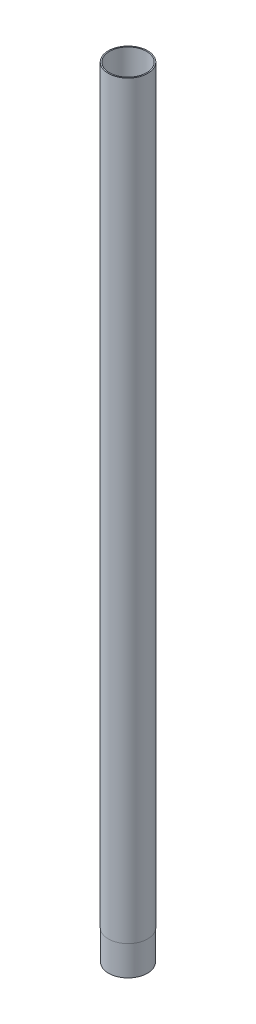
ISO-10303-21;
HEADER;
FILE_DESCRIPTION(('STEP AP214'),'2;1');
FILE_NAME('part.step','',(''),(''),'','','');
FILE_SCHEMA(('AUTOMOTIVE_DESIGN { 1 0 10303 214 1 1 1 1 }'));
ENDSEC;
DATA;
#1=APPLICATION_CONTEXT('core data for automotive mechanical design processes');
#2=APPLICATION_PROTOCOL_DEFINITION('international standard','automotive_design',2000,#1);
#3=PRODUCT_CONTEXT('',#1,'mechanical');
#4=PRODUCT('Part','Part','',(#3));
#5=PRODUCT_RELATED_PRODUCT_CATEGORY('part','',(#4));
#6=PRODUCT_DEFINITION_FORMATION('','',#4);
#7=PRODUCT_DEFINITION_CONTEXT('part definition',#1,'design');
#8=PRODUCT_DEFINITION('design','',#6,#7);
#9=PRODUCT_DEFINITION_SHAPE('','',#8);
#10=(LENGTH_UNIT() NAMED_UNIT(*) SI_UNIT(.MILLI.,.METRE.));
#11=(NAMED_UNIT(*) PLANE_ANGLE_UNIT() SI_UNIT($,.RADIAN.));
#12=(NAMED_UNIT(*) SI_UNIT($,.STERADIAN.) SOLID_ANGLE_UNIT());
#13=UNCERTAINTY_MEASURE_WITH_UNIT(LENGTH_MEASURE(1.E-05),#10,'distance_accuracy_value','');
#14=(GEOMETRIC_REPRESENTATION_CONTEXT(3) GLOBAL_UNCERTAINTY_ASSIGNED_CONTEXT((#13)) GLOBAL_UNIT_ASSIGNED_CONTEXT((#10,
#11,#12)) REPRESENTATION_CONTEXT('',''));
#15=CARTESIAN_POINT('',(0.,0.,0.));
#16=DIRECTION('',(0.,0.,1.));
#17=DIRECTION('',(1.,0.,0.));
#18=AXIS2_PLACEMENT_3D('',#15,#16,#17);
#19=CARTESIAN_POINT('',(9.525,0.,0.));
#20=DIRECTION('',(0.,-1.,0.));
#21=DIRECTION('',(0.,0.,-1.));
#22=AXIS2_PLACEMENT_3D('',#19,#20,#21);
#23=PLANE('',#22);
#24=CARTESIAN_POINT('',(9.525,0.,0.));
#25=DIRECTION('',(0.,1.,0.));
#26=DIRECTION('',(-1.,0.,0.));
#27=AXIS2_PLACEMENT_3D('',#24,#25,#26);
#28=CIRCLE('',#27,8.975);
#29=CARTESIAN_POINT('',(18.5,0.,0.));
#30=VERTEX_POINT('',#29);
#31=EDGE_CURVE('E27',#30,#30,#28,.T.);
#32=ORIENTED_EDGE('',*,*,#31,.F.);
#33=EDGE_LOOP('',(#32));
#34=FACE_BOUND('',#33,.T.);
#35=CARTESIAN_POINT('',(9.525,0.,0.));
#36=DIRECTION('',(0.,-1.,0.));
#37=DIRECTION('',(-1.,0.,0.));
#38=AXIS2_PLACEMENT_3D('',#35,#36,#37);
#39=CIRCLE('',#38,9.525);
#40=CARTESIAN_POINT('',(19.05,0.,0.));
#41=VERTEX_POINT('',#40);
#42=EDGE_CURVE('E59',#41,#41,#39,.T.);
#43=ORIENTED_EDGE('',*,*,#42,.F.);
#44=EDGE_LOOP('',(#43));
#45=FACE_BOUND('',#44,.T.);
#46=ADVANCED_FACE('F17',(#34,#45),#23,.F.);
#47=CARTESIAN_POINT('',(9.525,18.87,0.));
#48=DIRECTION('',(0.,-1.,0.));
#49=DIRECTION('',(-1.,0.,0.));
#50=AXIS2_PLACEMENT_3D('',#47,#48,#49);
#51=CYLINDRICAL_SURFACE('',#50,8.975);
#52=ORIENTED_EDGE('',*,*,#31,.T.);
#53=DIRECTION('',(0.,-1.,0.));
#54=VECTOR('',#53,1.);
#55=CARTESIAN_POINT('',(18.5,18.87,0.));
#56=LINE('',#55,#54);
#57=CARTESIAN_POINT('',(18.5,-377.4,0.));
#58=VERTEX_POINT('',#57);
#59=EDGE_CURVE('E11',#30,#58,#56,.T.);
#60=ORIENTED_EDGE('',*,*,#59,.T.);
#61=CARTESIAN_POINT('',(9.525,-377.4,0.));
#62=DIRECTION('',(0.,1.,0.));
#63=DIRECTION('',(-1.,0.,0.));
#64=AXIS2_PLACEMENT_3D('',#61,#62,#63);
#65=CIRCLE('',#64,8.975);
#66=EDGE_CURVE('E72',#58,#58,#65,.T.);
#67=ORIENTED_EDGE('',*,*,#66,.F.);
#68=ORIENTED_EDGE('',*,*,#59,.F.);
#69=EDGE_LOOP('',(#52,#60,#67,#68));
#70=FACE_BOUND('',#69,.T.);
#71=ADVANCED_FACE('F94',(#70),#51,.F.);
#72=CARTESIAN_POINT('',(9.525,-377.4,0.));
#73=DIRECTION('',(0.,-1.,0.));
#74=DIRECTION('',(0.,0.,-1.));
#75=AXIS2_PLACEMENT_3D('',#72,#73,#74);
#76=PLANE('',#75);
#77=ORIENTED_EDGE('',*,*,#66,.T.);
#78=EDGE_LOOP('',(#77));
#79=FACE_BOUND('',#78,.T.);
#80=CARTESIAN_POINT('',(9.525,-377.4,0.));
#81=DIRECTION('',(0.,1.,0.));
#82=DIRECTION('',(-1.,0.,0.));
#83=AXIS2_PLACEMENT_3D('',#80,#81,#82);
#84=CIRCLE('',#83,9.4);
#85=CARTESIAN_POINT('',(0.125,-377.4,0.));
#86=VERTEX_POINT('',#85);
#87=EDGE_CURVE('E66',#86,#86,#84,.T.);
#88=ORIENTED_EDGE('',*,*,#87,.F.);
#89=EDGE_LOOP('',(#88));
#90=FACE_BOUND('',#89,.T.);
#91=ADVANCED_FACE('F19',(#79,#90),#76,.T.);
#92=CARTESIAN_POINT('',(9.525,-378.125,0.));
#93=DIRECTION('',(0.,1.,0.));
#94=DIRECTION('',(1.,0.,0.));
#95=AXIS2_PLACEMENT_3D('',#92,#93,#94);
#96=CYLINDRICAL_SURFACE('',#95,9.4);
#97=CARTESIAN_POINT('',(9.525,-362.9,0.));
#98=DIRECTION('',(0.,-1.,0.));
#99=DIRECTION('',(1.,0.,0.));
#100=AXIS2_PLACEMENT_3D('',#97,#98,#99);
#101=CIRCLE('',#100,9.4);
#102=CARTESIAN_POINT('',(0.125,-362.9,0.));
#103=VERTEX_POINT('',#102);
#104=EDGE_CURVE('E80',#103,#103,#101,.T.);
#105=ORIENTED_EDGE('',*,*,#104,.T.);
#106=DIRECTION('',(0.,-1.,0.));
#107=VECTOR('',#106,1.);
#108=CARTESIAN_POINT('',(0.125,-378.125,0.));
#109=LINE('',#108,#107);
#110=EDGE_CURVE('E69',#103,#86,#109,.T.);
#111=ORIENTED_EDGE('',*,*,#110,.T.);
#112=ORIENTED_EDGE('',*,*,#87,.T.);
#113=ORIENTED_EDGE('',*,*,#110,.F.);
#114=EDGE_LOOP('',(#105,#111,#112,#113));
#115=FACE_BOUND('',#114,.T.);
#116=ADVANCED_FACE('F68',(#115),#96,.T.);
#117=CARTESIAN_POINT('',(9.525,-362.9,0.));
#118=DIRECTION('',(0.,1.,0.));
#119=DIRECTION('',(1.,0.,0.));
#120=AXIS2_PLACEMENT_3D('',#117,#118,#119);
#121=PLANE('',#120);
#122=ORIENTED_EDGE('',*,*,#104,.F.);
#123=EDGE_LOOP('',(#122));
#124=FACE_BOUND('',#123,.T.);
#125=CARTESIAN_POINT('',(9.525,-362.9,0.));
#126=DIRECTION('',(0.,-1.,0.));
#127=DIRECTION('',(-1.,0.,0.));
#128=AXIS2_PLACEMENT_3D('',#125,#126,#127);
#129=CIRCLE('',#128,9.525);
#130=CARTESIAN_POINT('',(19.05,-362.9,0.));
#131=VERTEX_POINT('',#130);
#132=EDGE_CURVE('E87',#131,#131,#129,.T.);
#133=ORIENTED_EDGE('',*,*,#132,.T.);
#134=EDGE_LOOP('',(#133));
#135=FACE_BOUND('',#134,.T.);
#136=ADVANCED_FACE('F136',(#124,#135),#121,.F.);
#137=CARTESIAN_POINT('',(9.525,18.87,0.));
#138=DIRECTION('',(0.,-1.,0.));
#139=DIRECTION('',(-1.,0.,0.));
#140=AXIS2_PLACEMENT_3D('',#137,#138,#139);
#141=CYLINDRICAL_SURFACE('',#140,9.525);
#142=ORIENTED_EDGE('',*,*,#132,.F.);
#143=DIRECTION('',(0.,1.,0.));
#144=VECTOR('',#143,1.);
#145=CARTESIAN_POINT('',(19.05,18.87,0.));
#146=LINE('',#145,#144);
#147=EDGE_CURVE('E51',#131,#41,#146,.T.);
#148=ORIENTED_EDGE('',*,*,#147,.T.);
#149=ORIENTED_EDGE('',*,*,#42,.T.);
#150=ORIENTED_EDGE('',*,*,#147,.F.);
#151=EDGE_LOOP('',(#142,#148,#149,#150));
#152=FACE_BOUND('',#151,.T.);
#153=ADVANCED_FACE('F100',(#152),#141,.T.);
#154=CLOSED_SHELL('',(#46,#71,#91,#116,#136,#153));
#155=MANIFOLD_SOLID_BREP('B1',#154);
#156=ADVANCED_BREP_SHAPE_REPRESENTATION('',(#18,#155),#14);
#157=SHAPE_DEFINITION_REPRESENTATION(#9,#156);
ENDSEC;
END-ISO-10303-21;
